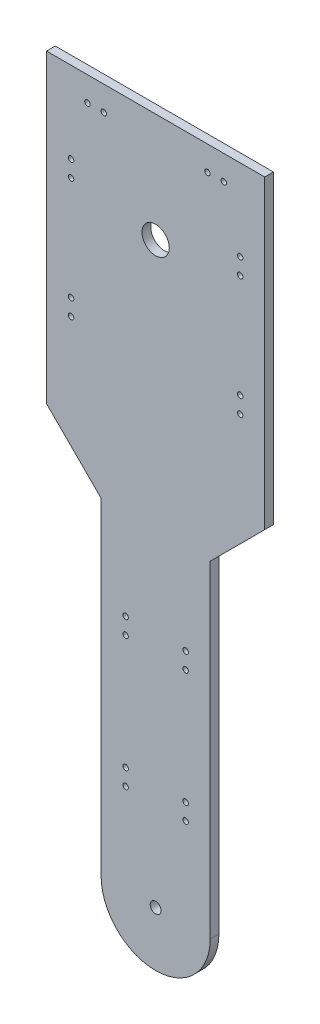
ISO-10303-21;
HEADER;
FILE_DESCRIPTION(('STEP AP214'),'2;1');
FILE_NAME('part.step','',(''),(''),'','','');
FILE_SCHEMA(('AUTOMOTIVE_DESIGN { 1 0 10303 214 1 1 1 1 }'));
ENDSEC;
DATA;
#1=APPLICATION_CONTEXT('core data for automotive mechanical design processes');
#2=APPLICATION_PROTOCOL_DEFINITION('international standard','automotive_design',2000,#1);
#3=PRODUCT_CONTEXT('',#1,'mechanical');
#4=PRODUCT('Part','Part','',(#3));
#5=PRODUCT_RELATED_PRODUCT_CATEGORY('part','',(#4));
#6=PRODUCT_DEFINITION_FORMATION('','',#4);
#7=PRODUCT_DEFINITION_CONTEXT('part definition',#1,'design');
#8=PRODUCT_DEFINITION('design','',#6,#7);
#9=PRODUCT_DEFINITION_SHAPE('','',#8);
#10=(LENGTH_UNIT() NAMED_UNIT(*) SI_UNIT(.MILLI.,.METRE.));
#11=(NAMED_UNIT(*) PLANE_ANGLE_UNIT() SI_UNIT($,.RADIAN.));
#12=(NAMED_UNIT(*) SI_UNIT($,.STERADIAN.) SOLID_ANGLE_UNIT());
#13=UNCERTAINTY_MEASURE_WITH_UNIT(LENGTH_MEASURE(1.E-05),#10,'distance_accuracy_value','');
#14=(GEOMETRIC_REPRESENTATION_CONTEXT(3) GLOBAL_UNCERTAINTY_ASSIGNED_CONTEXT((#13)) GLOBAL_UNIT_ASSIGNED_CONTEXT((#10,
#11,#12)) REPRESENTATION_CONTEXT('',''));
#15=CARTESIAN_POINT('',(0.,0.,0.));
#16=DIRECTION('',(0.,0.,1.));
#17=DIRECTION('',(1.,0.,0.));
#18=AXIS2_PLACEMENT_3D('',#15,#16,#17);
#19=CARTESIAN_POINT('',(1.27356325489975E-13,-530.,8.));
#20=DIRECTION('',(0.,0.,1.));
#21=DIRECTION('',(1.,0.,0.));
#22=AXIS2_PLACEMENT_3D('',#19,#20,#21);
#23=PLANE('',#22);
#24=CARTESIAN_POINT('',(-27.5000000000037,-432.499999999994,8.0000000000035));
#25=DIRECTION('',(0.,0.,1.));
#26=DIRECTION('',(1.,0.,0.));
#27=AXIS2_PLACEMENT_3D('',#24,#25,#26);
#28=CIRCLE('',#27,2.50000000000002);
#29=CARTESIAN_POINT('',(-25.0000000000037,-432.499999999994,8.0000000000035));
#30=VERTEX_POINT('',#29);
#31=EDGE_CURVE('E310',#30,#30,#28,.T.);
#32=ORIENTED_EDGE('',*,*,#31,.F.);
#33=EDGE_LOOP('',(#32));
#34=FACE_BOUND('',#33,.T.);
#35=CARTESIAN_POINT('',(-27.5000000000037,-447.499999999994,8.0000000000035));
#36=DIRECTION('',(0.,0.,1.));
#37=DIRECTION('',(1.,0.,0.));
#38=AXIS2_PLACEMENT_3D('',#35,#36,#37);
#39=CIRCLE('',#38,2.49999999999997);
#40=CARTESIAN_POINT('',(-25.0000000000038,-447.499999999994,8.0000000000035));
#41=VERTEX_POINT('',#40);
#42=EDGE_CURVE('E304',#41,#41,#39,.T.);
#43=ORIENTED_EDGE('',*,*,#42,.F.);
#44=EDGE_LOOP('',(#43));
#45=FACE_BOUND('',#44,.T.);
#46=CARTESIAN_POINT('',(-27.5000000000037,-312.499999999994,8.0000000000035));
#47=DIRECTION('',(0.,0.,1.));
#48=DIRECTION('',(1.,0.,0.));
#49=AXIS2_PLACEMENT_3D('',#46,#47,#48);
#50=CIRCLE('',#49,2.50000000000005);
#51=CARTESIAN_POINT('',(-25.0000000000036,-312.499999999994,8.0000000000035));
#52=VERTEX_POINT('',#51);
#53=EDGE_CURVE('E298',#52,#52,#50,.T.);
#54=ORIENTED_EDGE('',*,*,#53,.F.);
#55=EDGE_LOOP('',(#54));
#56=FACE_BOUND('',#55,.T.);
#57=CARTESIAN_POINT('',(-27.5000000000037,-327.499999999994,8.0000000000035));
#58=DIRECTION('',(0.,0.,1.));
#59=DIRECTION('',(1.,0.,0.));
#60=AXIS2_PLACEMENT_3D('',#57,#58,#59);
#61=CIRCLE('',#60,2.50000000000001);
#62=CARTESIAN_POINT('',(-25.0000000000037,-327.499999999994,8.0000000000035));
#63=VERTEX_POINT('',#62);
#64=EDGE_CURVE('E292',#63,#63,#61,.T.);
#65=ORIENTED_EDGE('',*,*,#64,.F.);
#66=EDGE_LOOP('',(#65));
#67=FACE_BOUND('',#66,.T.);
#68=CARTESIAN_POINT('',(-47.5000000000038,77.5000000000052,8.0000000000035));
#69=DIRECTION('',(0.,0.,1.));
#70=DIRECTION('',(1.,0.,0.));
#71=AXIS2_PLACEMENT_3D('',#68,#69,#70);
#72=CIRCLE('',#71,2.50000000000002);
#73=CARTESIAN_POINT('',(-45.0000000000038,77.5000000000052,8.0000000000035));
#74=VERTEX_POINT('',#73);
#75=EDGE_CURVE('E286',#74,#74,#72,.T.);
#76=ORIENTED_EDGE('',*,*,#75,.F.);
#77=EDGE_LOOP('',(#76));
#78=FACE_BOUND('',#77,.T.);
#79=CARTESIAN_POINT('',(-62.5000000000038,77.5000000000052,8.0000000000035));
#80=DIRECTION('',(0.,0.,1.));
#81=DIRECTION('',(1.,0.,0.));
#82=AXIS2_PLACEMENT_3D('',#79,#80,#81);
#83=CIRCLE('',#82,2.50000000000002);
#84=CARTESIAN_POINT('',(-60.0000000000038,77.5000000000052,8.0000000000035));
#85=VERTEX_POINT('',#84);
#86=EDGE_CURVE('E280',#85,#85,#83,.T.);
#87=ORIENTED_EDGE('',*,*,#86,.F.);
#88=EDGE_LOOP('',(#87));
#89=FACE_BOUND('',#88,.T.);
#90=CARTESIAN_POINT('',(-77.500000000004,25.5000000000054,8.0000000000035));
#91=DIRECTION('',(0.,0.,1.));
#92=DIRECTION('',(1.,0.,0.));
#93=AXIS2_PLACEMENT_3D('',#90,#91,#92);
#94=CIRCLE('',#93,2.50000000000002);
#95=CARTESIAN_POINT('',(-75.0000000000039,25.5000000000054,8.0000000000035));
#96=VERTEX_POINT('',#95);
#97=EDGE_CURVE('E274',#96,#96,#94,.T.);
#98=ORIENTED_EDGE('',*,*,#97,.F.);
#99=EDGE_LOOP('',(#98));
#100=FACE_BOUND('',#99,.T.);
#101=CARTESIAN_POINT('',(-77.5000000000039,10.5000000000053,8.0000000000035));
#102=DIRECTION('',(0.,0.,1.));
#103=DIRECTION('',(1.,0.,0.));
#104=AXIS2_PLACEMENT_3D('',#101,#102,#103);
#105=CIRCLE('',#104,2.49999999999997);
#106=CARTESIAN_POINT('',(-75.0000000000039,10.5000000000053,8.0000000000035));
#107=VERTEX_POINT('',#106);
#108=EDGE_CURVE('E268',#107,#107,#105,.T.);
#109=ORIENTED_EDGE('',*,*,#108,.F.);
#110=EDGE_LOOP('',(#109));
#111=FACE_BOUND('',#110,.T.);
#112=CARTESIAN_POINT('',(-77.500000000004,-84.4999999999946,8.0000000000035));
#113=DIRECTION('',(0.,0.,1.));
#114=DIRECTION('',(1.,0.,0.));
#115=AXIS2_PLACEMENT_3D('',#112,#113,#114);
#116=CIRCLE('',#115,2.50000000000006);
#117=CARTESIAN_POINT('',(-75.000000000004,-84.4999999999946,8.0000000000035));
#118=VERTEX_POINT('',#117);
#119=EDGE_CURVE('E262',#118,#118,#116,.T.);
#120=ORIENTED_EDGE('',*,*,#119,.F.);
#121=EDGE_LOOP('',(#120));
#122=FACE_BOUND('',#121,.T.);
#123=CARTESIAN_POINT('',(-77.500000000004,-99.4999999999946,8.0000000000035));
#124=DIRECTION('',(0.,0.,1.));
#125=DIRECTION('',(1.,0.,0.));
#126=AXIS2_PLACEMENT_3D('',#123,#124,#125);
#127=CIRCLE('',#126,2.50000000000002);
#128=CARTESIAN_POINT('',(-75.000000000004,-99.4999999999946,8.0000000000035));
#129=VERTEX_POINT('',#128);
#130=EDGE_CURVE('E256',#129,#129,#127,.T.);
#131=ORIENTED_EDGE('',*,*,#130,.F.);
#132=EDGE_LOOP('',(#131));
#133=FACE_BOUND('',#132,.T.);
#134=CARTESIAN_POINT('',(27.5000000000037,-432.499999999994,8.0000000000035));
#135=DIRECTION('',(0.,0.,-1.));
#136=DIRECTION('',(-1.,0.,0.));
#137=AXIS2_PLACEMENT_3D('',#134,#135,#136);
#138=CIRCLE('',#137,2.50000000000002);
#139=CARTESIAN_POINT('',(25.0000000000037,-432.499999999994,8.0000000000035));
#140=VERTEX_POINT('',#139);
#141=EDGE_CURVE('E245',#140,#140,#138,.T.);
#142=ORIENTED_EDGE('',*,*,#141,.T.);
#143=EDGE_LOOP('',(#142));
#144=FACE_BOUND('',#143,.T.);
#145=CARTESIAN_POINT('',(27.5000000000037,-447.499999999994,8.0000000000035));
#146=DIRECTION('',(0.,0.,-1.));
#147=DIRECTION('',(-1.,0.,0.));
#148=AXIS2_PLACEMENT_3D('',#145,#146,#147);
#149=CIRCLE('',#148,2.49999999999997);
#150=CARTESIAN_POINT('',(25.0000000000038,-447.499999999994,8.0000000000035));
#151=VERTEX_POINT('',#150);
#152=EDGE_CURVE('E239',#151,#151,#149,.T.);
#153=ORIENTED_EDGE('',*,*,#152,.T.);
#154=EDGE_LOOP('',(#153));
#155=FACE_BOUND('',#154,.T.);
#156=CARTESIAN_POINT('',(27.5000000000037,-312.499999999994,8.0000000000035));
#157=DIRECTION('',(0.,0.,-1.));
#158=DIRECTION('',(-1.,0.,0.));
#159=AXIS2_PLACEMENT_3D('',#156,#157,#158);
#160=CIRCLE('',#159,2.50000000000005);
#161=CARTESIAN_POINT('',(25.0000000000036,-312.499999999994,8.0000000000035));
#162=VERTEX_POINT('',#161);
#163=EDGE_CURVE('E233',#162,#162,#160,.T.);
#164=ORIENTED_EDGE('',*,*,#163,.T.);
#165=EDGE_LOOP('',(#164));
#166=FACE_BOUND('',#165,.T.);
#167=CARTESIAN_POINT('',(27.5000000000037,-327.499999999994,8.0000000000035));
#168=DIRECTION('',(0.,0.,-1.));
#169=DIRECTION('',(-1.,0.,0.));
#170=AXIS2_PLACEMENT_3D('',#167,#168,#169);
#171=CIRCLE('',#170,2.50000000000001);
#172=CARTESIAN_POINT('',(25.0000000000037,-327.499999999994,8.0000000000035));
#173=VERTEX_POINT('',#172);
#174=EDGE_CURVE('E227',#173,#173,#171,.T.);
#175=ORIENTED_EDGE('',*,*,#174,.T.);
#176=EDGE_LOOP('',(#175));
#177=FACE_BOUND('',#176,.T.);
#178=CARTESIAN_POINT('',(47.5000000000038,77.5000000000052,8.0000000000035));
#179=DIRECTION('',(0.,0.,-1.));
#180=DIRECTION('',(-1.,0.,0.));
#181=AXIS2_PLACEMENT_3D('',#178,#179,#180);
#182=CIRCLE('',#181,2.50000000000002);
#183=CARTESIAN_POINT('',(45.0000000000038,77.5000000000052,8.0000000000035));
#184=VERTEX_POINT('',#183);
#185=EDGE_CURVE('E221',#184,#184,#182,.T.);
#186=ORIENTED_EDGE('',*,*,#185,.T.);
#187=EDGE_LOOP('',(#186));
#188=FACE_BOUND('',#187,.T.);
#189=CARTESIAN_POINT('',(62.5000000000038,77.5000000000052,8.0000000000035));
#190=DIRECTION('',(0.,0.,-1.));
#191=DIRECTION('',(-1.,0.,0.));
#192=AXIS2_PLACEMENT_3D('',#189,#190,#191);
#193=CIRCLE('',#192,2.50000000000002);
#194=CARTESIAN_POINT('',(60.0000000000038,77.5000000000052,8.0000000000035));
#195=VERTEX_POINT('',#194);
#196=EDGE_CURVE('E215',#195,#195,#193,.T.);
#197=ORIENTED_EDGE('',*,*,#196,.T.);
#198=EDGE_LOOP('',(#197));
#199=FACE_BOUND('',#198,.T.);
#200=CARTESIAN_POINT('',(77.500000000004,25.5000000000054,8.0000000000035));
#201=DIRECTION('',(0.,0.,-1.));
#202=DIRECTION('',(-1.,0.,0.));
#203=AXIS2_PLACEMENT_3D('',#200,#201,#202);
#204=CIRCLE('',#203,2.50000000000002);
#205=CARTESIAN_POINT('',(75.0000000000039,25.5000000000054,8.0000000000035));
#206=VERTEX_POINT('',#205);
#207=EDGE_CURVE('E209',#206,#206,#204,.T.);
#208=ORIENTED_EDGE('',*,*,#207,.T.);
#209=EDGE_LOOP('',(#208));
#210=FACE_BOUND('',#209,.T.);
#211=CARTESIAN_POINT('',(77.5000000000039,10.5000000000053,8.0000000000035));
#212=DIRECTION('',(0.,0.,-1.));
#213=DIRECTION('',(-1.,0.,0.));
#214=AXIS2_PLACEMENT_3D('',#211,#212,#213);
#215=CIRCLE('',#214,2.49999999999997);
#216=CARTESIAN_POINT('',(75.0000000000039,10.5000000000053,8.0000000000035));
#217=VERTEX_POINT('',#216);
#218=EDGE_CURVE('E203',#217,#217,#215,.T.);
#219=ORIENTED_EDGE('',*,*,#218,.T.);
#220=EDGE_LOOP('',(#219));
#221=FACE_BOUND('',#220,.T.);
#222=CARTESIAN_POINT('',(77.500000000004,-84.4999999999946,8.0000000000035));
#223=DIRECTION('',(0.,0.,-1.));
#224=DIRECTION('',(-1.,0.,0.));
#225=AXIS2_PLACEMENT_3D('',#222,#223,#224);
#226=CIRCLE('',#225,2.50000000000006);
#227=CARTESIAN_POINT('',(75.000000000004,-84.4999999999946,8.0000000000035));
#228=VERTEX_POINT('',#227);
#229=EDGE_CURVE('E197',#228,#228,#226,.T.);
#230=ORIENTED_EDGE('',*,*,#229,.T.);
#231=EDGE_LOOP('',(#230));
#232=FACE_BOUND('',#231,.T.);
#233=CARTESIAN_POINT('',(77.500000000004,-99.4999999999946,8.0000000000035));
#234=DIRECTION('',(0.,0.,-1.));
#235=DIRECTION('',(-1.,0.,0.));
#236=AXIS2_PLACEMENT_3D('',#233,#234,#235);
#237=CIRCLE('',#236,2.50000000000002);
#238=CARTESIAN_POINT('',(75.000000000004,-99.4999999999946,8.0000000000035));
#239=VERTEX_POINT('',#238);
#240=EDGE_CURVE('E191',#239,#239,#237,.T.);
#241=ORIENTED_EDGE('',*,*,#240,.T.);
#242=EDGE_LOOP('',(#241));
#243=FACE_BOUND('',#242,.T.);
#244=CARTESIAN_POINT('',(1.27356325489975E-13,-530.,8.));
#245=DIRECTION('',(0.,0.,1.));
#246=DIRECTION('',(1.,0.,0.));
#247=AXIS2_PLACEMENT_3D('',#244,#245,#246);
#248=CIRCLE('',#247,5.);
#249=CARTESIAN_POINT('',(5.00000000000013,-530.,8.));
#250=VERTEX_POINT('',#249);
#251=EDGE_CURVE('E134',#250,#250,#248,.T.);
#252=ORIENTED_EDGE('',*,*,#251,.F.);
#253=EDGE_LOOP('',(#252));
#254=FACE_BOUND('',#253,.T.);
#255=DIRECTION('',(0.,-1.,0.));
#256=VECTOR('',#255,1.);
#257=CARTESIAN_POINT('',(-100.,100.,8.));
#258=LINE('',#257,#256);
#259=CARTESIAN_POINT('',(-100.,100.,8.));
#260=VERTEX_POINT('',#259);
#261=CARTESIAN_POINT('',(-99.9999999999999,-180.,8.));
#262=VERTEX_POINT('',#261);
#263=EDGE_CURVE('E93',#260,#262,#258,.T.);
#264=ORIENTED_EDGE('',*,*,#263,.T.);
#265=DIRECTION('',(0.707106781186549,-0.707106781186546,0.));
#266=VECTOR('',#265,1.);
#267=CARTESIAN_POINT('',(-99.9999999999999,-180.,8.));
#268=LINE('',#267,#266);
#269=CARTESIAN_POINT('',(-50.,-230.,8.));
#270=VERTEX_POINT('',#269);
#271=EDGE_CURVE('E179',#262,#270,#268,.T.);
#272=ORIENTED_EDGE('',*,*,#271,.T.);
#273=DIRECTION('',(0.,-1.,0.));
#274=VECTOR('',#273,1.);
#275=CARTESIAN_POINT('',(-50.,-230.,8.));
#276=LINE('',#275,#274);
#277=CARTESIAN_POINT('',(-49.9999999999999,-530.,8.));
#278=VERTEX_POINT('',#277);
#279=EDGE_CURVE('E162',#270,#278,#276,.T.);
#280=ORIENTED_EDGE('',*,*,#279,.T.);
#281=CARTESIAN_POINT('',(1.27356325489975E-13,-530.,8.));
#282=DIRECTION('',(0.,0.,1.));
#283=DIRECTION('',(1.,0.,0.));
#284=AXIS2_PLACEMENT_3D('',#281,#282,#283);
#285=CIRCLE('',#284,49.9999999999999);
#286=CARTESIAN_POINT('',(50.,-530.,8.));
#287=VERTEX_POINT('',#286);
#288=EDGE_CURVE('E175',#278,#287,#285,.T.);
#289=ORIENTED_EDGE('',*,*,#288,.T.);
#290=DIRECTION('',(0.,1.,0.));
#291=VECTOR('',#290,1.);
#292=CARTESIAN_POINT('',(49.9999999999999,-230.,8.));
#293=LINE('',#292,#291);
#294=CARTESIAN_POINT('',(49.9999999999999,-230.,8.));
#295=VERTEX_POINT('',#294);
#296=EDGE_CURVE('E113',#287,#295,#293,.T.);
#297=ORIENTED_EDGE('',*,*,#296,.T.);
#298=DIRECTION('',(0.707106781186549,0.707106781186546,0.));
#299=VECTOR('',#298,1.);
#300=CARTESIAN_POINT('',(100.,-180.,8.));
#301=LINE('',#300,#299);
#302=CARTESIAN_POINT('',(100.,-180.,8.));
#303=VERTEX_POINT('',#302);
#304=EDGE_CURVE('E107',#295,#303,#301,.T.);
#305=ORIENTED_EDGE('',*,*,#304,.T.);
#306=DIRECTION('',(0.,1.,0.));
#307=VECTOR('',#306,1.);
#308=CARTESIAN_POINT('',(100.,0.,8.));
#309=LINE('',#308,#307);
#310=CARTESIAN_POINT('',(100.,100.,8.));
#311=VERTEX_POINT('',#310);
#312=EDGE_CURVE('E111',#303,#311,#309,.T.);
#313=ORIENTED_EDGE('',*,*,#312,.T.);
#314=DIRECTION('',(-1.,0.,0.));
#315=VECTOR('',#314,1.);
#316=CARTESIAN_POINT('',(-100.,100.,8.));
#317=LINE('',#316,#315);
#318=EDGE_CURVE('E52',#311,#260,#317,.T.);
#319=ORIENTED_EDGE('',*,*,#318,.T.);
#320=EDGE_LOOP('',(#264,#272,#280,#289,#297,#305,#313,#319));
#321=FACE_BOUND('',#320,.T.);
#322=CARTESIAN_POINT('',(0.,0.,8.));
#323=DIRECTION('',(0.,0.,1.));
#324=DIRECTION('',(1.,0.,0.));
#325=AXIS2_PLACEMENT_3D('',#322,#323,#324);
#326=CIRCLE('',#325,12.5);
#327=CARTESIAN_POINT('',(12.5,0.,8.));
#328=VERTEX_POINT('',#327);
#329=EDGE_CURVE('E185',#328,#328,#326,.T.);
#330=ORIENTED_EDGE('',*,*,#329,.F.);
#331=EDGE_LOOP('',(#330));
#332=FACE_BOUND('',#331,.T.);
#333=ADVANCED_FACE('F35',(#34,#45,#56,#67,#78,#89,#100,#111,#122,#133,#144,#155,#166,#177,#188,
#199,#210,#221,#232,#243,#254,#321,#332),#23,.T.);
#334=CARTESIAN_POINT('',(1.27356325489975E-13,-530.,0.));
#335=DIRECTION('',(0.,0.,1.));
#336=DIRECTION('',(1.,0.,0.));
#337=AXIS2_PLACEMENT_3D('',#334,#335,#336);
#338=PLANE('',#337);
#339=CARTESIAN_POINT('',(-27.5000000000037,-432.499999999994,3.49720252756924E-12));
#340=DIRECTION('',(0.,0.,1.));
#341=DIRECTION('',(1.,0.,0.));
#342=AXIS2_PLACEMENT_3D('',#339,#340,#341);
#343=CIRCLE('',#342,2.50000000000002);
#344=CARTESIAN_POINT('',(-25.0000000000037,-432.499999999994,3.49720252756924E-12));
#345=VERTEX_POINT('',#344);
#346=EDGE_CURVE('E307',#345,#345,#343,.T.);
#347=ORIENTED_EDGE('',*,*,#346,.T.);
#348=EDGE_LOOP('',(#347));
#349=FACE_BOUND('',#348,.T.);
#350=CARTESIAN_POINT('',(-27.5000000000037,-447.499999999994,3.49720252756924E-12));
#351=DIRECTION('',(0.,0.,1.));
#352=DIRECTION('',(1.,0.,0.));
#353=AXIS2_PLACEMENT_3D('',#350,#351,#352);
#354=CIRCLE('',#353,2.49999999999997);
#355=CARTESIAN_POINT('',(-25.0000000000038,-447.499999999994,3.49720252756924E-12));
#356=VERTEX_POINT('',#355);
#357=EDGE_CURVE('E301',#356,#356,#354,.T.);
#358=ORIENTED_EDGE('',*,*,#357,.T.);
#359=EDGE_LOOP('',(#358));
#360=FACE_BOUND('',#359,.T.);
#361=CARTESIAN_POINT('',(-27.5000000000037,-312.499999999994,3.49720252756924E-12));
#362=DIRECTION('',(0.,0.,1.));
#363=DIRECTION('',(1.,0.,0.));
#364=AXIS2_PLACEMENT_3D('',#361,#362,#363);
#365=CIRCLE('',#364,2.50000000000005);
#366=CARTESIAN_POINT('',(-25.0000000000036,-312.499999999994,3.49720252756924E-12));
#367=VERTEX_POINT('',#366);
#368=EDGE_CURVE('E295',#367,#367,#365,.T.);
#369=ORIENTED_EDGE('',*,*,#368,.T.);
#370=EDGE_LOOP('',(#369));
#371=FACE_BOUND('',#370,.T.);
#372=CARTESIAN_POINT('',(-27.5000000000037,-327.499999999994,3.49720252756924E-12));
#373=DIRECTION('',(0.,0.,1.));
#374=DIRECTION('',(1.,0.,0.));
#375=AXIS2_PLACEMENT_3D('',#372,#373,#374);
#376=CIRCLE('',#375,2.50000000000001);
#377=CARTESIAN_POINT('',(-25.0000000000037,-327.499999999994,3.49720252756924E-12));
#378=VERTEX_POINT('',#377);
#379=EDGE_CURVE('E289',#378,#378,#376,.T.);
#380=ORIENTED_EDGE('',*,*,#379,.T.);
#381=EDGE_LOOP('',(#380));
#382=FACE_BOUND('',#381,.T.);
#383=CARTESIAN_POINT('',(-47.5000000000038,77.5000000000052,3.49720252756924E-12));
#384=DIRECTION('',(0.,0.,1.));
#385=DIRECTION('',(1.,0.,0.));
#386=AXIS2_PLACEMENT_3D('',#383,#384,#385);
#387=CIRCLE('',#386,2.50000000000002);
#388=CARTESIAN_POINT('',(-45.0000000000038,77.5000000000052,3.49720252756924E-12));
#389=VERTEX_POINT('',#388);
#390=EDGE_CURVE('E283',#389,#389,#387,.T.);
#391=ORIENTED_EDGE('',*,*,#390,.T.);
#392=EDGE_LOOP('',(#391));
#393=FACE_BOUND('',#392,.T.);
#394=CARTESIAN_POINT('',(-62.5000000000038,77.5000000000052,3.49720252756924E-12));
#395=DIRECTION('',(0.,0.,1.));
#396=DIRECTION('',(1.,0.,0.));
#397=AXIS2_PLACEMENT_3D('',#394,#395,#396);
#398=CIRCLE('',#397,2.50000000000002);
#399=CARTESIAN_POINT('',(-60.0000000000038,77.5000000000052,3.49720252756924E-12));
#400=VERTEX_POINT('',#399);
#401=EDGE_CURVE('E277',#400,#400,#398,.T.);
#402=ORIENTED_EDGE('',*,*,#401,.T.);
#403=EDGE_LOOP('',(#402));
#404=FACE_BOUND('',#403,.T.);
#405=CARTESIAN_POINT('',(-77.500000000004,25.5000000000054,3.49720252756924E-12));
#406=DIRECTION('',(0.,0.,1.));
#407=DIRECTION('',(1.,0.,0.));
#408=AXIS2_PLACEMENT_3D('',#405,#406,#407);
#409=CIRCLE('',#408,2.50000000000002);
#410=CARTESIAN_POINT('',(-75.0000000000039,25.5000000000054,3.49720252756924E-12));
#411=VERTEX_POINT('',#410);
#412=EDGE_CURVE('E271',#411,#411,#409,.T.);
#413=ORIENTED_EDGE('',*,*,#412,.T.);
#414=EDGE_LOOP('',(#413));
#415=FACE_BOUND('',#414,.T.);
#416=CARTESIAN_POINT('',(-77.5000000000039,10.5000000000053,3.49720252756924E-12));
#417=DIRECTION('',(0.,0.,1.));
#418=DIRECTION('',(1.,0.,0.));
#419=AXIS2_PLACEMENT_3D('',#416,#417,#418);
#420=CIRCLE('',#419,2.49999999999997);
#421=CARTESIAN_POINT('',(-75.0000000000039,10.5000000000053,3.49720252756924E-12));
#422=VERTEX_POINT('',#421);
#423=EDGE_CURVE('E265',#422,#422,#420,.T.);
#424=ORIENTED_EDGE('',*,*,#423,.T.);
#425=EDGE_LOOP('',(#424));
#426=FACE_BOUND('',#425,.T.);
#427=CARTESIAN_POINT('',(-77.500000000004,-84.4999999999946,3.49720252756924E-12));
#428=DIRECTION('',(0.,0.,1.));
#429=DIRECTION('',(1.,0.,0.));
#430=AXIS2_PLACEMENT_3D('',#427,#428,#429);
#431=CIRCLE('',#430,2.50000000000006);
#432=CARTESIAN_POINT('',(-75.000000000004,-84.4999999999946,3.49720252756924E-12));
#433=VERTEX_POINT('',#432);
#434=EDGE_CURVE('E259',#433,#433,#431,.T.);
#435=ORIENTED_EDGE('',*,*,#434,.T.);
#436=EDGE_LOOP('',(#435));
#437=FACE_BOUND('',#436,.T.);
#438=CARTESIAN_POINT('',(-77.500000000004,-99.4999999999946,3.49720252756924E-12));
#439=DIRECTION('',(0.,0.,1.));
#440=DIRECTION('',(1.,0.,0.));
#441=AXIS2_PLACEMENT_3D('',#438,#439,#440);
#442=CIRCLE('',#441,2.50000000000002);
#443=CARTESIAN_POINT('',(-75.000000000004,-99.4999999999946,3.49720252756924E-12));
#444=VERTEX_POINT('',#443);
#445=EDGE_CURVE('E251',#444,#444,#442,.T.);
#446=ORIENTED_EDGE('',*,*,#445,.T.);
#447=EDGE_LOOP('',(#446));
#448=FACE_BOUND('',#447,.T.);
#449=CARTESIAN_POINT('',(27.5000000000037,-432.499999999994,3.49720252756924E-12));
#450=DIRECTION('',(0.,0.,-1.));
#451=DIRECTION('',(-1.,0.,0.));
#452=AXIS2_PLACEMENT_3D('',#449,#450,#451);
#453=CIRCLE('',#452,2.50000000000002);
#454=CARTESIAN_POINT('',(25.0000000000037,-432.499999999994,3.49720252756924E-12));
#455=VERTEX_POINT('',#454);
#456=EDGE_CURVE('E248',#455,#455,#453,.T.);
#457=ORIENTED_EDGE('',*,*,#456,.F.);
#458=EDGE_LOOP('',(#457));
#459=FACE_BOUND('',#458,.T.);
#460=CARTESIAN_POINT('',(27.5000000000037,-447.499999999994,3.49720252756924E-12));
#461=DIRECTION('',(0.,0.,-1.));
#462=DIRECTION('',(-1.,0.,0.));
#463=AXIS2_PLACEMENT_3D('',#460,#461,#462);
#464=CIRCLE('',#463,2.49999999999997);
#465=CARTESIAN_POINT('',(25.0000000000038,-447.499999999994,3.49720252756924E-12));
#466=VERTEX_POINT('',#465);
#467=EDGE_CURVE('E242',#466,#466,#464,.T.);
#468=ORIENTED_EDGE('',*,*,#467,.F.);
#469=EDGE_LOOP('',(#468));
#470=FACE_BOUND('',#469,.T.);
#471=CARTESIAN_POINT('',(27.5000000000037,-312.499999999994,3.49720252756924E-12));
#472=DIRECTION('',(0.,0.,-1.));
#473=DIRECTION('',(-1.,0.,0.));
#474=AXIS2_PLACEMENT_3D('',#471,#472,#473);
#475=CIRCLE('',#474,2.50000000000005);
#476=CARTESIAN_POINT('',(25.0000000000036,-312.499999999994,3.49720252756924E-12));
#477=VERTEX_POINT('',#476);
#478=EDGE_CURVE('E236',#477,#477,#475,.T.);
#479=ORIENTED_EDGE('',*,*,#478,.F.);
#480=EDGE_LOOP('',(#479));
#481=FACE_BOUND('',#480,.T.);
#482=CARTESIAN_POINT('',(27.5000000000037,-327.499999999994,3.49720252756924E-12));
#483=DIRECTION('',(0.,0.,-1.));
#484=DIRECTION('',(-1.,0.,0.));
#485=AXIS2_PLACEMENT_3D('',#482,#483,#484);
#486=CIRCLE('',#485,2.50000000000001);
#487=CARTESIAN_POINT('',(25.0000000000037,-327.499999999994,3.49720252756924E-12));
#488=VERTEX_POINT('',#487);
#489=EDGE_CURVE('E230',#488,#488,#486,.T.);
#490=ORIENTED_EDGE('',*,*,#489,.F.);
#491=EDGE_LOOP('',(#490));
#492=FACE_BOUND('',#491,.T.);
#493=CARTESIAN_POINT('',(47.5000000000038,77.5000000000052,3.49720252756924E-12));
#494=DIRECTION('',(0.,0.,-1.));
#495=DIRECTION('',(-1.,0.,0.));
#496=AXIS2_PLACEMENT_3D('',#493,#494,#495);
#497=CIRCLE('',#496,2.50000000000002);
#498=CARTESIAN_POINT('',(45.0000000000038,77.5000000000052,3.49720252756924E-12));
#499=VERTEX_POINT('',#498);
#500=EDGE_CURVE('E224',#499,#499,#497,.T.);
#501=ORIENTED_EDGE('',*,*,#500,.F.);
#502=EDGE_LOOP('',(#501));
#503=FACE_BOUND('',#502,.T.);
#504=CARTESIAN_POINT('',(62.5000000000038,77.5000000000052,3.49720252756924E-12));
#505=DIRECTION('',(0.,0.,-1.));
#506=DIRECTION('',(-1.,0.,0.));
#507=AXIS2_PLACEMENT_3D('',#504,#505,#506);
#508=CIRCLE('',#507,2.50000000000002);
#509=CARTESIAN_POINT('',(60.0000000000038,77.5000000000052,3.49720252756924E-12));
#510=VERTEX_POINT('',#509);
#511=EDGE_CURVE('E218',#510,#510,#508,.T.);
#512=ORIENTED_EDGE('',*,*,#511,.F.);
#513=EDGE_LOOP('',(#512));
#514=FACE_BOUND('',#513,.T.);
#515=CARTESIAN_POINT('',(77.500000000004,25.5000000000054,3.49720252756924E-12));
#516=DIRECTION('',(0.,0.,-1.));
#517=DIRECTION('',(-1.,0.,0.));
#518=AXIS2_PLACEMENT_3D('',#515,#516,#517);
#519=CIRCLE('',#518,2.50000000000002);
#520=CARTESIAN_POINT('',(75.0000000000039,25.5000000000054,3.49720252756924E-12));
#521=VERTEX_POINT('',#520);
#522=EDGE_CURVE('E212',#521,#521,#519,.T.);
#523=ORIENTED_EDGE('',*,*,#522,.F.);
#524=EDGE_LOOP('',(#523));
#525=FACE_BOUND('',#524,.T.);
#526=CARTESIAN_POINT('',(77.5000000000039,10.5000000000053,3.49720252756924E-12));
#527=DIRECTION('',(0.,0.,-1.));
#528=DIRECTION('',(-1.,0.,0.));
#529=AXIS2_PLACEMENT_3D('',#526,#527,#528);
#530=CIRCLE('',#529,2.49999999999997);
#531=CARTESIAN_POINT('',(75.0000000000039,10.5000000000053,3.49720252756924E-12));
#532=VERTEX_POINT('',#531);
#533=EDGE_CURVE('E206',#532,#532,#530,.T.);
#534=ORIENTED_EDGE('',*,*,#533,.F.);
#535=EDGE_LOOP('',(#534));
#536=FACE_BOUND('',#535,.T.);
#537=CARTESIAN_POINT('',(77.500000000004,-84.4999999999946,3.49720252756924E-12));
#538=DIRECTION('',(0.,0.,-1.));
#539=DIRECTION('',(-1.,0.,0.));
#540=AXIS2_PLACEMENT_3D('',#537,#538,#539);
#541=CIRCLE('',#540,2.50000000000006);
#542=CARTESIAN_POINT('',(75.000000000004,-84.4999999999946,3.49720252756924E-12));
#543=VERTEX_POINT('',#542);
#544=EDGE_CURVE('E200',#543,#543,#541,.T.);
#545=ORIENTED_EDGE('',*,*,#544,.F.);
#546=EDGE_LOOP('',(#545));
#547=FACE_BOUND('',#546,.T.);
#548=CARTESIAN_POINT('',(77.500000000004,-99.4999999999946,3.49720252756924E-12));
#549=DIRECTION('',(0.,0.,-1.));
#550=DIRECTION('',(-1.,0.,0.));
#551=AXIS2_PLACEMENT_3D('',#548,#549,#550);
#552=CIRCLE('',#551,2.50000000000002);
#553=CARTESIAN_POINT('',(75.000000000004,-99.4999999999946,3.49720252756924E-12));
#554=VERTEX_POINT('',#553);
#555=EDGE_CURVE('E194',#554,#554,#552,.T.);
#556=ORIENTED_EDGE('',*,*,#555,.F.);
#557=EDGE_LOOP('',(#556));
#558=FACE_BOUND('',#557,.T.);
#559=DIRECTION('',(0.,-1.,0.));
#560=VECTOR('',#559,1.);
#561=CARTESIAN_POINT('',(-99.9999999999999,0.,0.));
#562=LINE('',#561,#560);
#563=CARTESIAN_POINT('',(-100.,100.,0.));
#564=VERTEX_POINT('',#563);
#565=CARTESIAN_POINT('',(-99.9999999999999,-180.,0.));
#566=VERTEX_POINT('',#565);
#567=EDGE_CURVE('E87',#564,#566,#562,.T.);
#568=ORIENTED_EDGE('',*,*,#567,.F.);
#569=DIRECTION('',(-1.,0.,0.));
#570=VECTOR('',#569,1.);
#571=CARTESIAN_POINT('',(-100.,100.,0.));
#572=LINE('',#571,#570);
#573=CARTESIAN_POINT('',(100.,100.,0.));
#574=VERTEX_POINT('',#573);
#575=EDGE_CURVE('E144',#574,#564,#572,.T.);
#576=ORIENTED_EDGE('',*,*,#575,.F.);
#577=DIRECTION('',(0.,1.,0.));
#578=VECTOR('',#577,1.);
#579=CARTESIAN_POINT('',(100.,100.,0.));
#580=LINE('',#579,#578);
#581=CARTESIAN_POINT('',(100.,-180.,0.));
#582=VERTEX_POINT('',#581);
#583=EDGE_CURVE('E80',#582,#574,#580,.T.);
#584=ORIENTED_EDGE('',*,*,#583,.F.);
#585=DIRECTION('',(0.707106781186549,0.707106781186546,0.));
#586=VECTOR('',#585,1.);
#587=CARTESIAN_POINT('',(100.,-180.,0.));
#588=LINE('',#587,#586);
#589=CARTESIAN_POINT('',(49.9999999999999,-230.,0.));
#590=VERTEX_POINT('',#589);
#591=EDGE_CURVE('E122',#590,#582,#588,.T.);
#592=ORIENTED_EDGE('',*,*,#591,.F.);
#593=DIRECTION('',(0.,1.,0.));
#594=VECTOR('',#593,1.);
#595=CARTESIAN_POINT('',(49.9999999999999,-230.,0.));
#596=LINE('',#595,#594);
#597=CARTESIAN_POINT('',(50.,-530.,0.));
#598=VERTEX_POINT('',#597);
#599=EDGE_CURVE('E140',#598,#590,#596,.T.);
#600=ORIENTED_EDGE('',*,*,#599,.F.);
#601=CARTESIAN_POINT('',(1.27356325489975E-13,-530.,0.));
#602=DIRECTION('',(0.,0.,1.));
#603=DIRECTION('',(1.,0.,0.));
#604=AXIS2_PLACEMENT_3D('',#601,#602,#603);
#605=CIRCLE('',#604,49.9999999999999);
#606=CARTESIAN_POINT('',(-49.9999999999999,-530.,0.));
#607=VERTEX_POINT('',#606);
#608=EDGE_CURVE('E138',#607,#598,#605,.T.);
#609=ORIENTED_EDGE('',*,*,#608,.F.);
#610=DIRECTION('',(0.,-1.,0.));
#611=VECTOR('',#610,1.);
#612=CARTESIAN_POINT('',(-50.,-230.,0.));
#613=LINE('',#612,#611);
#614=CARTESIAN_POINT('',(-50.,-230.,0.));
#615=VERTEX_POINT('',#614);
#616=EDGE_CURVE('E136',#615,#607,#613,.T.);
#617=ORIENTED_EDGE('',*,*,#616,.F.);
#618=DIRECTION('',(0.707106781186549,-0.707106781186546,0.));
#619=VECTOR('',#618,1.);
#620=CARTESIAN_POINT('',(-99.9999999999999,-180.,0.));
#621=LINE('',#620,#619);
#622=EDGE_CURVE('E133',#566,#615,#621,.T.);
#623=ORIENTED_EDGE('',*,*,#622,.F.);
#624=EDGE_LOOP('',(#568,#576,#584,#592,#600,#609,#617,#623));
#625=FACE_BOUND('',#624,.T.);
#626=CARTESIAN_POINT('',(1.27356325489975E-13,-530.,0.));
#627=DIRECTION('',(0.,0.,1.));
#628=DIRECTION('',(1.,0.,0.));
#629=AXIS2_PLACEMENT_3D('',#626,#627,#628);
#630=CIRCLE('',#629,5.);
#631=CARTESIAN_POINT('',(5.00000000000013,-530.,0.));
#632=VERTEX_POINT('',#631);
#633=EDGE_CURVE('E182',#632,#632,#630,.T.);
#634=ORIENTED_EDGE('',*,*,#633,.T.);
#635=EDGE_LOOP('',(#634));
#636=FACE_BOUND('',#635,.T.);
#637=CARTESIAN_POINT('',(0.,0.,0.));
#638=DIRECTION('',(0.,0.,1.));
#639=DIRECTION('',(1.,0.,0.));
#640=AXIS2_PLACEMENT_3D('',#637,#638,#639);
#641=CIRCLE('',#640,12.5);
#642=CARTESIAN_POINT('',(12.5,0.,0.));
#643=VERTEX_POINT('',#642);
#644=EDGE_CURVE('E188',#643,#643,#641,.T.);
#645=ORIENTED_EDGE('',*,*,#644,.T.);
#646=EDGE_LOOP('',(#645));
#647=FACE_BOUND('',#646,.T.);
#648=ADVANCED_FACE('F166',(#349,#360,#371,#382,#393,#404,#415,#426,#437,#448,#459,#470,#481,
#492,#503,#514,#525,#536,#547,#558,#625,#636,#647),#338,.F.);
#649=CARTESIAN_POINT('',(-99.9999999999999,0.,8.));
#650=DIRECTION('',(1.,0.,0.));
#651=DIRECTION('',(0.,1.,0.));
#652=AXIS2_PLACEMENT_3D('',#649,#650,#651);
#653=PLANE('',#652);
#654=ORIENTED_EDGE('',*,*,#567,.T.);
#655=DIRECTION('',(0.,0.,-1.));
#656=VECTOR('',#655,1.);
#657=CARTESIAN_POINT('',(-99.9999999999999,-180.,8.));
#658=LINE('',#657,#656);
#659=EDGE_CURVE('E11',#262,#566,#658,.T.);
#660=ORIENTED_EDGE('',*,*,#659,.F.);
#661=ORIENTED_EDGE('',*,*,#263,.F.);
#662=DIRECTION('',(0.,0.,-1.));
#663=VECTOR('',#662,1.);
#664=CARTESIAN_POINT('',(-100.,100.,8.));
#665=LINE('',#664,#663);
#666=EDGE_CURVE('E128',#260,#564,#665,.T.);
#667=ORIENTED_EDGE('',*,*,#666,.T.);
#668=EDGE_LOOP('',(#654,#660,#661,#667));
#669=FACE_BOUND('',#668,.T.);
#670=ADVANCED_FACE('F37',(#669),#653,.F.);
#671=CARTESIAN_POINT('',(-99.9999999999999,-180.,8.));
#672=DIRECTION('',(0.707106781186546,0.707106781186549,0.));
#673=DIRECTION('',(-0.707106781186549,0.707106781186546,0.));
#674=AXIS2_PLACEMENT_3D('',#671,#672,#673);
#675=PLANE('',#674);
#676=ORIENTED_EDGE('',*,*,#622,.T.);
#677=DIRECTION('',(0.,0.,-1.));
#678=VECTOR('',#677,1.);
#679=CARTESIAN_POINT('',(-50.,-230.,8.));
#680=LINE('',#679,#678);
#681=EDGE_CURVE('E44',#270,#615,#680,.T.);
#682=ORIENTED_EDGE('',*,*,#681,.F.);
#683=ORIENTED_EDGE('',*,*,#271,.F.);
#684=ORIENTED_EDGE('',*,*,#659,.T.);
#685=EDGE_LOOP('',(#676,#682,#683,#684));
#686=FACE_BOUND('',#685,.T.);
#687=ADVANCED_FACE('F397',(#686),#675,.F.);
#688=CARTESIAN_POINT('',(-50.,-230.,8.));
#689=DIRECTION('',(1.,0.,0.));
#690=DIRECTION('',(0.,1.,0.));
#691=AXIS2_PLACEMENT_3D('',#688,#689,#690);
#692=PLANE('',#691);
#693=ORIENTED_EDGE('',*,*,#616,.T.);
#694=DIRECTION('',(0.,0.,-1.));
#695=VECTOR('',#694,1.);
#696=CARTESIAN_POINT('',(-49.9999999999999,-530.,8.));
#697=LINE('',#696,#695);
#698=EDGE_CURVE('E153',#278,#607,#697,.T.);
#699=ORIENTED_EDGE('',*,*,#698,.F.);
#700=ORIENTED_EDGE('',*,*,#279,.F.);
#701=ORIENTED_EDGE('',*,*,#681,.T.);
#702=EDGE_LOOP('',(#693,#699,#700,#701));
#703=FACE_BOUND('',#702,.T.);
#704=ADVANCED_FACE('F160',(#703),#692,.F.);
#705=CARTESIAN_POINT('',(1.27356325489975E-13,-530.,8.));
#706=DIRECTION('',(0.,0.,-1.));
#707=DIRECTION('',(-1.,0.,0.));
#708=AXIS2_PLACEMENT_3D('',#705,#706,#707);
#709=CYLINDRICAL_SURFACE('',#708,49.9999999999999);
#710=ORIENTED_EDGE('',*,*,#608,.T.);
#711=DIRECTION('',(0.,0.,-1.));
#712=VECTOR('',#711,1.);
#713=CARTESIAN_POINT('',(50.,-530.,8.));
#714=LINE('',#713,#712);
#715=EDGE_CURVE('E150',#287,#598,#714,.T.);
#716=ORIENTED_EDGE('',*,*,#715,.F.);
#717=ORIENTED_EDGE('',*,*,#288,.F.);
#718=ORIENTED_EDGE('',*,*,#698,.T.);
#719=EDGE_LOOP('',(#710,#716,#717,#718));
#720=FACE_BOUND('',#719,.T.);
#721=ADVANCED_FACE('F171',(#720),#709,.T.);
#722=CARTESIAN_POINT('',(49.9999999999999,-230.,8.));
#723=DIRECTION('',(-1.,0.,0.));
#724=DIRECTION('',(0.,-1.,0.));
#725=AXIS2_PLACEMENT_3D('',#722,#723,#724);
#726=PLANE('',#725);
#727=ORIENTED_EDGE('',*,*,#599,.T.);
#728=DIRECTION('',(0.,0.,-1.));
#729=VECTOR('',#728,1.);
#730=CARTESIAN_POINT('',(49.9999999999999,-230.,8.));
#731=LINE('',#730,#729);
#732=EDGE_CURVE('E123',#295,#590,#731,.T.);
#733=ORIENTED_EDGE('',*,*,#732,.F.);
#734=ORIENTED_EDGE('',*,*,#296,.F.);
#735=ORIENTED_EDGE('',*,*,#715,.T.);
#736=EDGE_LOOP('',(#727,#733,#734,#735));
#737=FACE_BOUND('',#736,.T.);
#738=ADVANCED_FACE('F174',(#737),#726,.F.);
#739=CARTESIAN_POINT('',(100.,-180.,8.));
#740=DIRECTION('',(-0.707106781186546,0.707106781186549,0.));
#741=DIRECTION('',(-0.707106781186549,-0.707106781186546,0.));
#742=AXIS2_PLACEMENT_3D('',#739,#740,#741);
#743=PLANE('',#742);
#744=ORIENTED_EDGE('',*,*,#591,.T.);
#745=DIRECTION('',(0.,0.,-1.));
#746=VECTOR('',#745,1.);
#747=CARTESIAN_POINT('',(100.,-180.,8.));
#748=LINE('',#747,#746);
#749=EDGE_CURVE('E119',#303,#582,#748,.T.);
#750=ORIENTED_EDGE('',*,*,#749,.F.);
#751=ORIENTED_EDGE('',*,*,#304,.F.);
#752=ORIENTED_EDGE('',*,*,#732,.T.);
#753=EDGE_LOOP('',(#744,#750,#751,#752));
#754=FACE_BOUND('',#753,.T.);
#755=ADVANCED_FACE('F120',(#754),#743,.F.);
#756=CARTESIAN_POINT('',(100.,100.,8.));
#757=DIRECTION('',(-1.,0.,0.));
#758=DIRECTION('',(0.,0.,1.));
#759=AXIS2_PLACEMENT_3D('',#756,#757,#758);
#760=PLANE('',#759);
#761=ORIENTED_EDGE('',*,*,#583,.T.);
#762=DIRECTION('',(0.,0.,-1.));
#763=VECTOR('',#762,1.);
#764=CARTESIAN_POINT('',(100.,100.,8.));
#765=LINE('',#764,#763);
#766=EDGE_CURVE('E124',#311,#574,#765,.T.);
#767=ORIENTED_EDGE('',*,*,#766,.F.);
#768=ORIENTED_EDGE('',*,*,#312,.F.);
#769=ORIENTED_EDGE('',*,*,#749,.T.);
#770=EDGE_LOOP('',(#761,#767,#768,#769));
#771=FACE_BOUND('',#770,.T.);
#772=ADVANCED_FACE('F126',(#771),#760,.F.);
#773=CARTESIAN_POINT('',(-100.,100.,8.));
#774=DIRECTION('',(0.,-1.,0.));
#775=DIRECTION('',(1.,0.,0.));
#776=AXIS2_PLACEMENT_3D('',#773,#774,#775);
#777=PLANE('',#776);
#778=ORIENTED_EDGE('',*,*,#575,.T.);
#779=ORIENTED_EDGE('',*,*,#666,.F.);
#780=ORIENTED_EDGE('',*,*,#318,.F.);
#781=ORIENTED_EDGE('',*,*,#766,.T.);
#782=EDGE_LOOP('',(#778,#779,#780,#781));
#783=FACE_BOUND('',#782,.T.);
#784=ADVANCED_FACE('F364',(#783),#777,.F.);
#785=CARTESIAN_POINT('',(1.27356325489975E-13,-530.,8.));
#786=DIRECTION('',(0.,0.,-1.));
#787=DIRECTION('',(-1.,0.,0.));
#788=AXIS2_PLACEMENT_3D('',#785,#786,#787);
#789=CYLINDRICAL_SURFACE('',#788,5.);
#790=ORIENTED_EDGE('',*,*,#251,.T.);
#791=EDGE_LOOP('',(#790));
#792=FACE_BOUND('',#791,.T.);
#793=ORIENTED_EDGE('',*,*,#633,.F.);
#794=EDGE_LOOP('',(#793));
#795=FACE_BOUND('',#794,.T.);
#796=ADVANCED_FACE('F360',(#792,#795),#789,.F.);
#797=CARTESIAN_POINT('',(0.,0.,8.));
#798=DIRECTION('',(0.,0.,-1.));
#799=DIRECTION('',(-1.,0.,0.));
#800=AXIS2_PLACEMENT_3D('',#797,#798,#799);
#801=CYLINDRICAL_SURFACE('',#800,12.5);
#802=ORIENTED_EDGE('',*,*,#329,.T.);
#803=EDGE_LOOP('',(#802));
#804=FACE_BOUND('',#803,.T.);
#805=ORIENTED_EDGE('',*,*,#644,.F.);
#806=EDGE_LOOP('',(#805));
#807=FACE_BOUND('',#806,.T.);
#808=ADVANCED_FACE('F363',(#804,#807),#801,.F.);
#809=CARTESIAN_POINT('',(77.500000000004,-99.4999999999946,8.0000000000035));
#810=DIRECTION('',(0.,0.,-1.));
#811=DIRECTION('',(-1.,0.,0.));
#812=AXIS2_PLACEMENT_3D('',#809,#810,#811);
#813=CYLINDRICAL_SURFACE('',#812,2.50000000000002);
#814=ORIENTED_EDGE('',*,*,#240,.F.);
#815=EDGE_LOOP('',(#814));
#816=FACE_BOUND('',#815,.T.);
#817=ORIENTED_EDGE('',*,*,#555,.T.);
#818=EDGE_LOOP('',(#817));
#819=FACE_BOUND('',#818,.T.);
#820=ADVANCED_FACE('F374',(#816,#819),#813,.F.);
#821=CARTESIAN_POINT('',(77.500000000004,-84.4999999999946,8.0000000000035));
#822=DIRECTION('',(0.,0.,-1.));
#823=DIRECTION('',(-1.,0.,0.));
#824=AXIS2_PLACEMENT_3D('',#821,#822,#823);
#825=CYLINDRICAL_SURFACE('',#824,2.50000000000006);
#826=ORIENTED_EDGE('',*,*,#229,.F.);
#827=EDGE_LOOP('',(#826));
#828=FACE_BOUND('',#827,.T.);
#829=ORIENTED_EDGE('',*,*,#544,.T.);
#830=EDGE_LOOP('',(#829));
#831=FACE_BOUND('',#830,.T.);
#832=ADVANCED_FACE('F380',(#828,#831),#825,.F.);
#833=CARTESIAN_POINT('',(77.5000000000039,10.5000000000053,8.0000000000035));
#834=DIRECTION('',(0.,0.,-1.));
#835=DIRECTION('',(-1.,0.,0.));
#836=AXIS2_PLACEMENT_3D('',#833,#834,#835);
#837=CYLINDRICAL_SURFACE('',#836,2.49999999999997);
#838=ORIENTED_EDGE('',*,*,#218,.F.);
#839=EDGE_LOOP('',(#838));
#840=FACE_BOUND('',#839,.T.);
#841=ORIENTED_EDGE('',*,*,#533,.T.);
#842=EDGE_LOOP('',(#841));
#843=FACE_BOUND('',#842,.T.);
#844=ADVANCED_FACE('F487',(#840,#843),#837,.F.);
#845=CARTESIAN_POINT('',(77.500000000004,25.5000000000054,8.0000000000035));
#846=DIRECTION('',(0.,0.,-1.));
#847=DIRECTION('',(-1.,0.,0.));
#848=AXIS2_PLACEMENT_3D('',#845,#846,#847);
#849=CYLINDRICAL_SURFACE('',#848,2.50000000000002);
#850=ORIENTED_EDGE('',*,*,#207,.F.);
#851=EDGE_LOOP('',(#850));
#852=FACE_BOUND('',#851,.T.);
#853=ORIENTED_EDGE('',*,*,#522,.T.);
#854=EDGE_LOOP('',(#853));
#855=FACE_BOUND('',#854,.T.);
#856=ADVANCED_FACE('F477',(#852,#855),#849,.F.);
#857=CARTESIAN_POINT('',(62.5000000000038,77.5000000000052,8.0000000000035));
#858=DIRECTION('',(0.,0.,-1.));
#859=DIRECTION('',(-1.,0.,0.));
#860=AXIS2_PLACEMENT_3D('',#857,#858,#859);
#861=CYLINDRICAL_SURFACE('',#860,2.50000000000002);
#862=ORIENTED_EDGE('',*,*,#196,.F.);
#863=EDGE_LOOP('',(#862));
#864=FACE_BOUND('',#863,.T.);
#865=ORIENTED_EDGE('',*,*,#511,.T.);
#866=EDGE_LOOP('',(#865));
#867=FACE_BOUND('',#866,.T.);
#868=ADVANCED_FACE('F467',(#864,#867),#861,.F.);
#869=CARTESIAN_POINT('',(47.5000000000038,77.5000000000052,8.0000000000035));
#870=DIRECTION('',(0.,0.,-1.));
#871=DIRECTION('',(-1.,0.,0.));
#872=AXIS2_PLACEMENT_3D('',#869,#870,#871);
#873=CYLINDRICAL_SURFACE('',#872,2.50000000000002);
#874=ORIENTED_EDGE('',*,*,#185,.F.);
#875=EDGE_LOOP('',(#874));
#876=FACE_BOUND('',#875,.T.);
#877=ORIENTED_EDGE('',*,*,#500,.T.);
#878=EDGE_LOOP('',(#877));
#879=FACE_BOUND('',#878,.T.);
#880=ADVANCED_FACE('F457',(#876,#879),#873,.F.);
#881=CARTESIAN_POINT('',(27.5000000000037,-327.499999999994,8.0000000000035));
#882=DIRECTION('',(0.,0.,-1.));
#883=DIRECTION('',(-1.,0.,0.));
#884=AXIS2_PLACEMENT_3D('',#881,#882,#883);
#885=CYLINDRICAL_SURFACE('',#884,2.50000000000001);
#886=ORIENTED_EDGE('',*,*,#174,.F.);
#887=EDGE_LOOP('',(#886));
#888=FACE_BOUND('',#887,.T.);
#889=ORIENTED_EDGE('',*,*,#489,.T.);
#890=EDGE_LOOP('',(#889));
#891=FACE_BOUND('',#890,.T.);
#892=ADVANCED_FACE('F447',(#888,#891),#885,.F.);
#893=CARTESIAN_POINT('',(27.5000000000037,-312.499999999994,8.0000000000035));
#894=DIRECTION('',(0.,0.,-1.));
#895=DIRECTION('',(-1.,0.,0.));
#896=AXIS2_PLACEMENT_3D('',#893,#894,#895);
#897=CYLINDRICAL_SURFACE('',#896,2.50000000000005);
#898=ORIENTED_EDGE('',*,*,#163,.F.);
#899=EDGE_LOOP('',(#898));
#900=FACE_BOUND('',#899,.T.);
#901=ORIENTED_EDGE('',*,*,#478,.T.);
#902=EDGE_LOOP('',(#901));
#903=FACE_BOUND('',#902,.T.);
#904=ADVANCED_FACE('F437',(#900,#903),#897,.F.);
#905=CARTESIAN_POINT('',(27.5000000000037,-447.499999999994,8.0000000000035));
#906=DIRECTION('',(0.,0.,-1.));
#907=DIRECTION('',(-1.,0.,0.));
#908=AXIS2_PLACEMENT_3D('',#905,#906,#907);
#909=CYLINDRICAL_SURFACE('',#908,2.49999999999997);
#910=ORIENTED_EDGE('',*,*,#152,.F.);
#911=EDGE_LOOP('',(#910));
#912=FACE_BOUND('',#911,.T.);
#913=ORIENTED_EDGE('',*,*,#467,.T.);
#914=EDGE_LOOP('',(#913));
#915=FACE_BOUND('',#914,.T.);
#916=ADVANCED_FACE('F425',(#912,#915),#909,.F.);
#917=CARTESIAN_POINT('',(27.5000000000037,-432.499999999994,8.0000000000035));
#918=DIRECTION('',(0.,0.,-1.));
#919=DIRECTION('',(-1.,0.,0.));
#920=AXIS2_PLACEMENT_3D('',#917,#918,#919);
#921=CYLINDRICAL_SURFACE('',#920,2.50000000000002);
#922=ORIENTED_EDGE('',*,*,#141,.F.);
#923=EDGE_LOOP('',(#922));
#924=FACE_BOUND('',#923,.T.);
#925=ORIENTED_EDGE('',*,*,#456,.T.);
#926=EDGE_LOOP('',(#925));
#927=FACE_BOUND('',#926,.T.);
#928=ADVANCED_FACE('F419',(#924,#927),#921,.F.);
#929=CARTESIAN_POINT('',(-77.500000000004,-99.4999999999946,8.0000000000035));
#930=DIRECTION('',(0.,0.,-1.));
#931=DIRECTION('',(1.,0.,0.));
#932=AXIS2_PLACEMENT_3D('',#929,#930,#931);
#933=CYLINDRICAL_SURFACE('',#932,2.50000000000002);
#934=ORIENTED_EDGE('',*,*,#130,.T.);
#935=EDGE_LOOP('',(#934));
#936=FACE_BOUND('',#935,.T.);
#937=ORIENTED_EDGE('',*,*,#445,.F.);
#938=EDGE_LOOP('',(#937));
#939=FACE_BOUND('',#938,.T.);
#940=ADVANCED_FACE('F424',(#936,#939),#933,.F.);
#941=CARTESIAN_POINT('',(-77.500000000004,-84.4999999999946,8.0000000000035));
#942=DIRECTION('',(0.,0.,-1.));
#943=DIRECTION('',(1.,0.,0.));
#944=AXIS2_PLACEMENT_3D('',#941,#942,#943);
#945=CYLINDRICAL_SURFACE('',#944,2.50000000000006);
#946=ORIENTED_EDGE('',*,*,#119,.T.);
#947=EDGE_LOOP('',(#946));
#948=FACE_BOUND('',#947,.T.);
#949=ORIENTED_EDGE('',*,*,#434,.F.);
#950=EDGE_LOOP('',(#949));
#951=FACE_BOUND('',#950,.T.);
#952=ADVANCED_FACE('F578',(#948,#951),#945,.F.);
#953=CARTESIAN_POINT('',(-77.5000000000039,10.5000000000053,8.0000000000035));
#954=DIRECTION('',(0.,0.,-1.));
#955=DIRECTION('',(1.,0.,0.));
#956=AXIS2_PLACEMENT_3D('',#953,#954,#955);
#957=CYLINDRICAL_SURFACE('',#956,2.49999999999997);
#958=ORIENTED_EDGE('',*,*,#108,.T.);
#959=EDGE_LOOP('',(#958));
#960=FACE_BOUND('',#959,.T.);
#961=ORIENTED_EDGE('',*,*,#423,.F.);
#962=EDGE_LOOP('',(#961));
#963=FACE_BOUND('',#962,.T.);
#964=ADVANCED_FACE('F582',(#960,#963),#957,.F.);
#965=CARTESIAN_POINT('',(-77.500000000004,25.5000000000054,8.0000000000035));
#966=DIRECTION('',(0.,0.,-1.));
#967=DIRECTION('',(1.,0.,0.));
#968=AXIS2_PLACEMENT_3D('',#965,#966,#967);
#969=CYLINDRICAL_SURFACE('',#968,2.50000000000002);
#970=ORIENTED_EDGE('',*,*,#97,.T.);
#971=EDGE_LOOP('',(#970));
#972=FACE_BOUND('',#971,.T.);
#973=ORIENTED_EDGE('',*,*,#412,.F.);
#974=EDGE_LOOP('',(#973));
#975=FACE_BOUND('',#974,.T.);
#976=ADVANCED_FACE('F586',(#972,#975),#969,.F.);
#977=CARTESIAN_POINT('',(-62.5000000000038,77.5000000000052,8.0000000000035));
#978=DIRECTION('',(0.,0.,-1.));
#979=DIRECTION('',(1.,0.,0.));
#980=AXIS2_PLACEMENT_3D('',#977,#978,#979);
#981=CYLINDRICAL_SURFACE('',#980,2.50000000000002);
#982=ORIENTED_EDGE('',*,*,#86,.T.);
#983=EDGE_LOOP('',(#982));
#984=FACE_BOUND('',#983,.T.);
#985=ORIENTED_EDGE('',*,*,#401,.F.);
#986=EDGE_LOOP('',(#985));
#987=FACE_BOUND('',#986,.T.);
#988=ADVANCED_FACE('F590',(#984,#987),#981,.F.);
#989=CARTESIAN_POINT('',(-47.5000000000038,77.5000000000052,8.0000000000035));
#990=DIRECTION('',(0.,0.,-1.));
#991=DIRECTION('',(1.,0.,0.));
#992=AXIS2_PLACEMENT_3D('',#989,#990,#991);
#993=CYLINDRICAL_SURFACE('',#992,2.50000000000002);
#994=ORIENTED_EDGE('',*,*,#75,.T.);
#995=EDGE_LOOP('',(#994));
#996=FACE_BOUND('',#995,.T.);
#997=ORIENTED_EDGE('',*,*,#390,.F.);
#998=EDGE_LOOP('',(#997));
#999=FACE_BOUND('',#998,.T.);
#1000=ADVANCED_FACE('F594',(#996,#999),#993,.F.);
#1001=CARTESIAN_POINT('',(-27.5000000000037,-327.499999999994,8.0000000000035));
#1002=DIRECTION('',(0.,0.,-1.));
#1003=DIRECTION('',(1.,0.,0.));
#1004=AXIS2_PLACEMENT_3D('',#1001,#1002,#1003);
#1005=CYLINDRICAL_SURFACE('',#1004,2.50000000000001);
#1006=ORIENTED_EDGE('',*,*,#64,.T.);
#1007=EDGE_LOOP('',(#1006));
#1008=FACE_BOUND('',#1007,.T.);
#1009=ORIENTED_EDGE('',*,*,#379,.F.);
#1010=EDGE_LOOP('',(#1009));
#1011=FACE_BOUND('',#1010,.T.);
#1012=ADVANCED_FACE('F598',(#1008,#1011),#1005,.F.);
#1013=CARTESIAN_POINT('',(-27.5000000000037,-312.499999999994,8.0000000000035));
#1014=DIRECTION('',(0.,0.,-1.));
#1015=DIRECTION('',(1.,0.,0.));
#1016=AXIS2_PLACEMENT_3D('',#1013,#1014,#1015);
#1017=CYLINDRICAL_SURFACE('',#1016,2.50000000000005);
#1018=ORIENTED_EDGE('',*,*,#53,.T.);
#1019=EDGE_LOOP('',(#1018));
#1020=FACE_BOUND('',#1019,.T.);
#1021=ORIENTED_EDGE('',*,*,#368,.F.);
#1022=EDGE_LOOP('',(#1021));
#1023=FACE_BOUND('',#1022,.T.);
#1024=ADVANCED_FACE('F602',(#1020,#1023),#1017,.F.);
#1025=CARTESIAN_POINT('',(-27.5000000000037,-447.499999999994,8.0000000000035));
#1026=DIRECTION('',(0.,0.,-1.));
#1027=DIRECTION('',(1.,0.,0.));
#1028=AXIS2_PLACEMENT_3D('',#1025,#1026,#1027);
#1029=CYLINDRICAL_SURFACE('',#1028,2.49999999999997);
#1030=ORIENTED_EDGE('',*,*,#42,.T.);
#1031=EDGE_LOOP('',(#1030));
#1032=FACE_BOUND('',#1031,.T.);
#1033=ORIENTED_EDGE('',*,*,#357,.F.);
#1034=EDGE_LOOP('',(#1033));
#1035=FACE_BOUND('',#1034,.T.);
#1036=ADVANCED_FACE('F606',(#1032,#1035),#1029,.F.);
#1037=CARTESIAN_POINT('',(-27.5000000000037,-432.499999999994,8.0000000000035));
#1038=DIRECTION('',(0.,0.,-1.));
#1039=DIRECTION('',(1.,0.,0.));
#1040=AXIS2_PLACEMENT_3D('',#1037,#1038,#1039);
#1041=CYLINDRICAL_SURFACE('',#1040,2.50000000000002);
#1042=ORIENTED_EDGE('',*,*,#31,.T.);
#1043=EDGE_LOOP('',(#1042));
#1044=FACE_BOUND('',#1043,.T.);
#1045=ORIENTED_EDGE('',*,*,#346,.F.);
#1046=EDGE_LOOP('',(#1045));
#1047=FACE_BOUND('',#1046,.T.);
#1048=ADVANCED_FACE('F314',(#1044,#1047),#1041,.F.);
#1049=CLOSED_SHELL('',(#333,#648,#670,#687,#704,#721,#738,#755,#772,#784,#796,#808,#820,#832,
#844,#856,#868,#880,#892,#904,#916,#928,#940,#952,#964,#976,#988,#1000,#1012,#1024,#1036,#1048));
#1050=MANIFOLD_SOLID_BREP('B2',#1049);
#1051=ADVANCED_BREP_SHAPE_REPRESENTATION('',(#18,#1050),#14);
#1052=SHAPE_DEFINITION_REPRESENTATION(#9,#1051);
ENDSEC;
END-ISO-10303-21;
